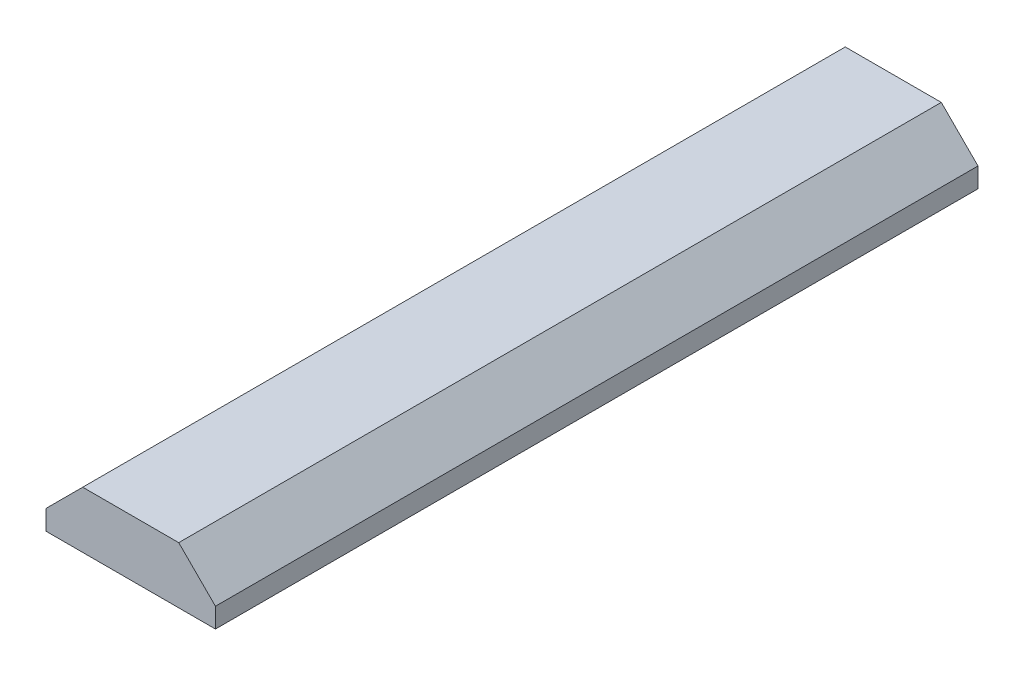
ISO-10303-21;
HEADER;
FILE_DESCRIPTION(('STEP AP214'),'2;1');
FILE_NAME('part.step','',(''),(''),'','','');
FILE_SCHEMA(('AUTOMOTIVE_DESIGN { 1 0 10303 214 1 1 1 1 }'));
ENDSEC;
DATA;
#1=APPLICATION_CONTEXT('core data for automotive mechanical design processes');
#2=APPLICATION_PROTOCOL_DEFINITION('international standard','automotive_design',2000,#1);
#3=PRODUCT_CONTEXT('',#1,'mechanical');
#4=PRODUCT('Part','Part','',(#3));
#5=PRODUCT_RELATED_PRODUCT_CATEGORY('part','',(#4));
#6=PRODUCT_DEFINITION_FORMATION('','',#4);
#7=PRODUCT_DEFINITION_CONTEXT('part definition',#1,'design');
#8=PRODUCT_DEFINITION('design','',#6,#7);
#9=PRODUCT_DEFINITION_SHAPE('','',#8);
#10=(LENGTH_UNIT() NAMED_UNIT(*) SI_UNIT(.MILLI.,.METRE.));
#11=(NAMED_UNIT(*) PLANE_ANGLE_UNIT() SI_UNIT($,.RADIAN.));
#12=(NAMED_UNIT(*) SI_UNIT($,.STERADIAN.) SOLID_ANGLE_UNIT());
#13=UNCERTAINTY_MEASURE_WITH_UNIT(LENGTH_MEASURE(1.E-05),#10,'distance_accuracy_value','');
#14=(GEOMETRIC_REPRESENTATION_CONTEXT(3) GLOBAL_UNCERTAINTY_ASSIGNED_CONTEXT((#13)) GLOBAL_UNIT_ASSIGNED_CONTEXT((#10,
#11,#12)) REPRESENTATION_CONTEXT('',''));
#15=CARTESIAN_POINT('',(0.,0.,0.));
#16=DIRECTION('',(0.,0.,1.));
#17=DIRECTION('',(1.,0.,0.));
#18=AXIS2_PLACEMENT_3D('',#15,#16,#17);
#19=CARTESIAN_POINT('',(3.4,1.80885878693797,54.));
#20=DIRECTION('',(0.707106781186549,0.707106781186546,0.));
#21=DIRECTION('',(-0.707106781186546,0.707106781186549,0.));
#22=AXIS2_PLACEMENT_3D('',#19,#20,#21);
#23=PLANE('',#22);
#24=DIRECTION('',(0.707106781186546,-0.707106781186549,0.));
#25=VECTOR('',#24,1.);
#26=CARTESIAN_POINT('',(3.4,1.80885878693797,0.));
#27=LINE('',#26,#25);
#28=CARTESIAN_POINT('',(3.4,1.80885878693797,0.));
#29=VERTEX_POINT('',#28);
#30=CARTESIAN_POINT('',(6.,-0.791141213062042,0.));
#31=VERTEX_POINT('',#30);
#32=EDGE_CURVE('E139',#29,#31,#27,.T.);
#33=ORIENTED_EDGE('',*,*,#32,.F.);
#34=DIRECTION('',(0.,0.,-1.));
#35=VECTOR('',#34,1.);
#36=CARTESIAN_POINT('',(3.4,1.80885878693797,54.));
#37=LINE('',#36,#35);
#38=CARTESIAN_POINT('',(3.4,1.80885878693797,54.));
#39=VERTEX_POINT('',#38);
#40=EDGE_CURVE('E11',#39,#29,#37,.T.);
#41=ORIENTED_EDGE('',*,*,#40,.F.);
#42=DIRECTION('',(0.707106781186546,-0.707106781186549,0.));
#43=VECTOR('',#42,1.);
#44=CARTESIAN_POINT('',(3.4,1.80885878693797,54.));
#45=LINE('',#44,#43);
#46=CARTESIAN_POINT('',(6.,-0.791141213062042,54.));
#47=VERTEX_POINT('',#46);
#48=EDGE_CURVE('E157',#39,#47,#45,.T.);
#49=ORIENTED_EDGE('',*,*,#48,.T.);
#50=DIRECTION('',(0.,0.,-1.));
#51=VECTOR('',#50,1.);
#52=CARTESIAN_POINT('',(6.,-0.791141213062042,54.));
#53=LINE('',#52,#51);
#54=EDGE_CURVE('E50',#47,#31,#53,.T.);
#55=ORIENTED_EDGE('',*,*,#54,.T.);
#56=EDGE_LOOP('',(#33,#41,#49,#55));
#57=FACE_BOUND('',#56,.T.);
#58=ADVANCED_FACE('F47',(#57),#23,.T.);
#59=CARTESIAN_POINT('',(3.4,1.80885878693797,54.));
#60=DIRECTION('',(0.,-1.,0.));
#61=DIRECTION('',(0.,0.,-1.));
#62=AXIS2_PLACEMENT_3D('',#59,#60,#61);
#63=PLANE('',#62);
#64=DIRECTION('',(-1.,0.,0.));
#65=VECTOR('',#64,1.);
#66=CARTESIAN_POINT('',(3.4,1.80885878693797,0.));
#67=LINE('',#66,#65);
#68=CARTESIAN_POINT('',(-3.4,1.80885878693797,0.));
#69=VERTEX_POINT('',#68);
#70=EDGE_CURVE('E87',#29,#69,#67,.T.);
#71=ORIENTED_EDGE('',*,*,#70,.T.);
#72=DIRECTION('',(0.,0.,-1.));
#73=VECTOR('',#72,1.);
#74=CARTESIAN_POINT('',(-3.4,1.80885878693797,54.));
#75=LINE('',#74,#73);
#76=CARTESIAN_POINT('',(-3.4,1.80885878693797,54.));
#77=VERTEX_POINT('',#76);
#78=EDGE_CURVE('E57',#77,#69,#75,.T.);
#79=ORIENTED_EDGE('',*,*,#78,.F.);
#80=DIRECTION('',(-1.,0.,0.));
#81=VECTOR('',#80,1.);
#82=CARTESIAN_POINT('',(3.4,1.80885878693797,54.));
#83=LINE('',#82,#81);
#84=EDGE_CURVE('E112',#39,#77,#83,.T.);
#85=ORIENTED_EDGE('',*,*,#84,.F.);
#86=ORIENTED_EDGE('',*,*,#40,.T.);
#87=EDGE_LOOP('',(#71,#79,#85,#86));
#88=FACE_BOUND('',#87,.T.);
#89=ADVANCED_FACE('F183',(#88),#63,.F.);
#90=CARTESIAN_POINT('',(-3.4,1.80885878693797,54.));
#91=DIRECTION('',(0.707106781186549,-0.707106781186546,0.));
#92=DIRECTION('',(0.707106781186546,0.707106781186549,0.));
#93=AXIS2_PLACEMENT_3D('',#90,#91,#92);
#94=PLANE('',#93);
#95=DIRECTION('',(-0.707106781186546,-0.707106781186549,0.));
#96=VECTOR('',#95,1.);
#97=CARTESIAN_POINT('',(-3.4,1.80885878693797,0.));
#98=LINE('',#97,#96);
#99=CARTESIAN_POINT('',(-6.,-0.791141213062042,0.));
#100=VERTEX_POINT('',#99);
#101=EDGE_CURVE('E120',#69,#100,#98,.T.);
#102=ORIENTED_EDGE('',*,*,#101,.T.);
#103=DIRECTION('',(0.,0.,-1.));
#104=VECTOR('',#103,1.);
#105=CARTESIAN_POINT('',(-6.,-0.791141213062042,54.));
#106=LINE('',#105,#104);
#107=CARTESIAN_POINT('',(-6.,-0.791141213062042,54.));
#108=VERTEX_POINT('',#107);
#109=EDGE_CURVE('E117',#108,#100,#106,.T.);
#110=ORIENTED_EDGE('',*,*,#109,.F.);
#111=DIRECTION('',(-0.707106781186546,-0.707106781186549,0.));
#112=VECTOR('',#111,1.);
#113=CARTESIAN_POINT('',(-3.4,1.80885878693797,54.));
#114=LINE('',#113,#112);
#115=EDGE_CURVE('E105',#77,#108,#114,.T.);
#116=ORIENTED_EDGE('',*,*,#115,.F.);
#117=ORIENTED_EDGE('',*,*,#78,.T.);
#118=EDGE_LOOP('',(#102,#110,#116,#117));
#119=FACE_BOUND('',#118,.T.);
#120=ADVANCED_FACE('F118',(#119),#94,.F.);
#121=CARTESIAN_POINT('',(-6.,-0.791141213062042,54.));
#122=DIRECTION('',(1.,0.,0.));
#123=DIRECTION('',(0.,0.,-1.));
#124=AXIS2_PLACEMENT_3D('',#121,#122,#123);
#125=PLANE('',#124);
#126=DIRECTION('',(0.,-1.,0.));
#127=VECTOR('',#126,1.);
#128=CARTESIAN_POINT('',(-6.,-0.791141213062042,0.));
#129=LINE('',#128,#127);
#130=CARTESIAN_POINT('',(-6.,-2.19114121306203,0.));
#131=VERTEX_POINT('',#130);
#132=EDGE_CURVE('E151',#100,#131,#129,.T.);
#133=ORIENTED_EDGE('',*,*,#132,.T.);
#134=DIRECTION('',(0.,0.,-1.));
#135=VECTOR('',#134,1.);
#136=CARTESIAN_POINT('',(-6.,-2.19114121306203,54.));
#137=LINE('',#136,#135);
#138=CARTESIAN_POINT('',(-6.,-2.19114121306203,54.));
#139=VERTEX_POINT('',#138);
#140=EDGE_CURVE('E124',#139,#131,#137,.T.);
#141=ORIENTED_EDGE('',*,*,#140,.F.);
#142=DIRECTION('',(0.,-1.,0.));
#143=VECTOR('',#142,1.);
#144=CARTESIAN_POINT('',(-6.,-0.791141213062042,54.));
#145=LINE('',#144,#143);
#146=EDGE_CURVE('E110',#108,#139,#145,.T.);
#147=ORIENTED_EDGE('',*,*,#146,.F.);
#148=ORIENTED_EDGE('',*,*,#109,.T.);
#149=EDGE_LOOP('',(#133,#141,#147,#148));
#150=FACE_BOUND('',#149,.T.);
#151=ADVANCED_FACE('F126',(#150),#125,.F.);
#152=CARTESIAN_POINT('',(-6.,-2.19114121306203,54.));
#153=DIRECTION('',(0.,1.,0.));
#154=DIRECTION('',(0.,0.,1.));
#155=AXIS2_PLACEMENT_3D('',#152,#153,#154);
#156=PLANE('',#155);
#157=DIRECTION('',(1.,0.,0.));
#158=VECTOR('',#157,1.);
#159=CARTESIAN_POINT('',(-6.,-2.19114121306203,0.));
#160=LINE('',#159,#158);
#161=CARTESIAN_POINT('',(6.,-2.19114121306203,0.));
#162=VERTEX_POINT('',#161);
#163=EDGE_CURVE('E147',#131,#162,#160,.T.);
#164=ORIENTED_EDGE('',*,*,#163,.T.);
#165=DIRECTION('',(0.,0.,-1.));
#166=VECTOR('',#165,1.);
#167=CARTESIAN_POINT('',(6.,-2.19114121306203,54.));
#168=LINE('',#167,#166);
#169=CARTESIAN_POINT('',(6.,-2.19114121306203,54.));
#170=VERTEX_POINT('',#169);
#171=EDGE_CURVE('E162',#170,#162,#168,.T.);
#172=ORIENTED_EDGE('',*,*,#171,.F.);
#173=DIRECTION('',(1.,0.,0.));
#174=VECTOR('',#173,1.);
#175=CARTESIAN_POINT('',(-6.,-2.19114121306203,54.));
#176=LINE('',#175,#174);
#177=EDGE_CURVE('E130',#139,#170,#176,.T.);
#178=ORIENTED_EDGE('',*,*,#177,.F.);
#179=ORIENTED_EDGE('',*,*,#140,.T.);
#180=EDGE_LOOP('',(#164,#172,#178,#179));
#181=FACE_BOUND('',#180,.T.);
#182=ADVANCED_FACE('F171',(#181),#156,.F.);
#183=CARTESIAN_POINT('',(6.,-0.791141213062042,54.));
#184=DIRECTION('',(1.,0.,0.));
#185=DIRECTION('',(0.,0.,-1.));
#186=AXIS2_PLACEMENT_3D('',#183,#184,#185);
#187=PLANE('',#186);
#188=DIRECTION('',(0.,-1.,0.));
#189=VECTOR('',#188,1.);
#190=CARTESIAN_POINT('',(6.,-0.791141213062042,0.));
#191=LINE('',#190,#189);
#192=EDGE_CURVE('E143',#31,#162,#191,.T.);
#193=ORIENTED_EDGE('',*,*,#192,.F.);
#194=ORIENTED_EDGE('',*,*,#54,.F.);
#195=DIRECTION('',(0.,-1.,0.));
#196=VECTOR('',#195,1.);
#197=CARTESIAN_POINT('',(6.,-0.791141213062042,54.));
#198=LINE('',#197,#196);
#199=EDGE_CURVE('E133',#47,#170,#198,.T.);
#200=ORIENTED_EDGE('',*,*,#199,.T.);
#201=ORIENTED_EDGE('',*,*,#171,.T.);
#202=EDGE_LOOP('',(#193,#194,#200,#201));
#203=FACE_BOUND('',#202,.T.);
#204=ADVANCED_FACE('F166',(#203),#187,.T.);
#205=CARTESIAN_POINT('',(0.,0.,54.));
#206=DIRECTION('',(0.,0.,-1.));
#207=DIRECTION('',(-1.,0.,0.));
#208=AXIS2_PLACEMENT_3D('',#205,#206,#207);
#209=PLANE('',#208);
#210=ORIENTED_EDGE('',*,*,#48,.F.);
#211=ORIENTED_EDGE('',*,*,#84,.T.);
#212=ORIENTED_EDGE('',*,*,#115,.T.);
#213=ORIENTED_EDGE('',*,*,#146,.T.);
#214=ORIENTED_EDGE('',*,*,#177,.T.);
#215=ORIENTED_EDGE('',*,*,#199,.F.);
#216=EDGE_LOOP('',(#210,#211,#212,#213,#214,#215));
#217=FACE_BOUND('',#216,.T.);
#218=ADVANCED_FACE('F108',(#217),#209,.F.);
#219=CARTESIAN_POINT('',(0.,0.,0.));
#220=DIRECTION('',(0.,0.,-1.));
#221=DIRECTION('',(-1.,0.,0.));
#222=AXIS2_PLACEMENT_3D('',#219,#220,#221);
#223=PLANE('',#222);
#224=ORIENTED_EDGE('',*,*,#32,.T.);
#225=ORIENTED_EDGE('',*,*,#192,.T.);
#226=ORIENTED_EDGE('',*,*,#163,.F.);
#227=ORIENTED_EDGE('',*,*,#132,.F.);
#228=ORIENTED_EDGE('',*,*,#101,.F.);
#229=ORIENTED_EDGE('',*,*,#70,.F.);
#230=EDGE_LOOP('',(#224,#225,#226,#227,#228,#229));
#231=FACE_BOUND('',#230,.T.);
#232=ADVANCED_FACE('F169',(#231),#223,.T.);
#233=CLOSED_SHELL('',(#58,#89,#120,#151,#182,#204,#218,#232));
#234=MANIFOLD_SOLID_BREP('B2',#233);
#235=ADVANCED_BREP_SHAPE_REPRESENTATION('',(#18,#234),#14);
#236=SHAPE_DEFINITION_REPRESENTATION(#9,#235);
ENDSEC;
END-ISO-10303-21;
